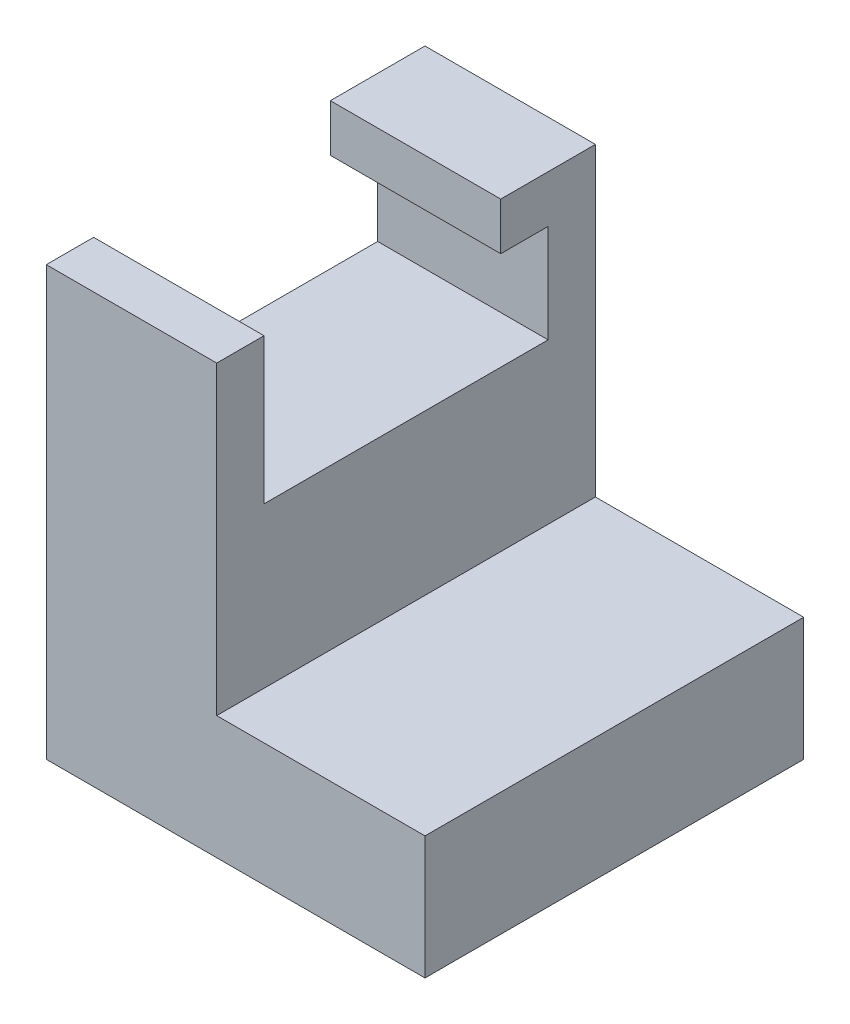
ISO-10303-21;
HEADER;
FILE_DESCRIPTION(('STEP AP214'),'2;1');
FILE_NAME('part.step','',(''),(''),'','','');
FILE_SCHEMA(('AUTOMOTIVE_DESIGN { 1 0 10303 214 1 1 1 1 }'));
ENDSEC;
DATA;
#1=APPLICATION_CONTEXT('core data for automotive mechanical design processes');
#2=APPLICATION_PROTOCOL_DEFINITION('international standard','automotive_design',2000,#1);
#3=PRODUCT_CONTEXT('',#1,'mechanical');
#4=PRODUCT('Part','Part','',(#3));
#5=PRODUCT_RELATED_PRODUCT_CATEGORY('part','',(#4));
#6=PRODUCT_DEFINITION_FORMATION('','',#4);
#7=PRODUCT_DEFINITION_CONTEXT('part definition',#1,'design');
#8=PRODUCT_DEFINITION('design','',#6,#7);
#9=PRODUCT_DEFINITION_SHAPE('','',#8);
#10=(LENGTH_UNIT() NAMED_UNIT(*) SI_UNIT(.MILLI.,.METRE.));
#11=(NAMED_UNIT(*) PLANE_ANGLE_UNIT() SI_UNIT($,.RADIAN.));
#12=(NAMED_UNIT(*) SI_UNIT($,.STERADIAN.) SOLID_ANGLE_UNIT());
#13=UNCERTAINTY_MEASURE_WITH_UNIT(LENGTH_MEASURE(1.E-05),#10,'distance_accuracy_value','');
#14=(GEOMETRIC_REPRESENTATION_CONTEXT(3) GLOBAL_UNCERTAINTY_ASSIGNED_CONTEXT((#13)) GLOBAL_UNIT_ASSIGNED_CONTEXT((#10,
#11,#12)) REPRESENTATION_CONTEXT('',''));
#15=CARTESIAN_POINT('',(0.,0.,0.));
#16=DIRECTION('',(0.,0.,1.));
#17=DIRECTION('',(1.,0.,0.));
#18=AXIS2_PLACEMENT_3D('',#15,#16,#17);
#19=CARTESIAN_POINT('',(-17.2543735035618,42.0680833709945,40.));
#20=DIRECTION('',(0.,-1.,0.));
#21=DIRECTION('',(0.,0.,-1.));
#22=AXIS2_PLACEMENT_3D('',#19,#20,#21);
#23=PLANE('',#22);
#24=DIRECTION('',(0.,0.,-1.));
#25=VECTOR('',#24,1.);
#26=CARTESIAN_POINT('',(-17.2543735035618,42.0680833709945,40.));
#27=LINE('',#26,#25);
#28=CARTESIAN_POINT('',(-17.2543735035618,42.0680833709945,40.));
#29=VERTEX_POINT('',#28);
#30=CARTESIAN_POINT('',(-17.2543735035618,42.0680833709945,35.));
#31=VERTEX_POINT('',#30);
#32=EDGE_CURVE('E143',#29,#31,#27,.T.);
#33=ORIENTED_EDGE('',*,*,#32,.T.);
#34=DIRECTION('',(1.,0.,0.));
#35=VECTOR('',#34,1.);
#36=CARTESIAN_POINT('',(-57.2543735035618,42.0680833709945,35.));
#37=LINE('',#36,#35);
#38=CARTESIAN_POINT('',(-35.2543735035618,42.0680833709945,35.));
#39=VERTEX_POINT('',#38);
#40=EDGE_CURVE('E126',#39,#31,#37,.T.);
#41=ORIENTED_EDGE('',*,*,#40,.F.);
#42=DIRECTION('',(0.,0.,-1.));
#43=VECTOR('',#42,1.);
#44=CARTESIAN_POINT('',(-35.2543735035618,42.0680833709945,40.));
#45=LINE('',#44,#43);
#46=CARTESIAN_POINT('',(-35.2543735035618,42.0680833709945,40.));
#47=VERTEX_POINT('',#46);
#48=EDGE_CURVE('E139',#47,#39,#45,.T.);
#49=ORIENTED_EDGE('',*,*,#48,.F.);
#50=DIRECTION('',(-1.,0.,0.));
#51=VECTOR('',#50,1.);
#52=CARTESIAN_POINT('',(-17.2543735035618,42.0680833709945,40.));
#53=LINE('',#52,#51);
#54=EDGE_CURVE('E89',#29,#47,#53,.T.);
#55=ORIENTED_EDGE('',*,*,#54,.F.);
#56=EDGE_LOOP('',(#33,#41,#49,#55));
#57=FACE_BOUND('',#56,.T.);
#58=ADVANCED_FACE('F33',(#57),#23,.F.);
#59=CARTESIAN_POINT('',(-17.2543735035618,42.0680833709945,40.));
#60=DIRECTION('',(-1.,0.,0.));
#61=DIRECTION('',(0.,0.,1.));
#62=AXIS2_PLACEMENT_3D('',#59,#60,#61);
#63=PLANE('',#62);
#64=DIRECTION('',(0.,0.,-1.));
#65=VECTOR('',#64,1.);
#66=CARTESIAN_POINT('',(-17.2543735035618,26.6890693876861,5.));
#67=LINE('',#66,#65);
#68=CARTESIAN_POINT('',(-17.2543735035618,26.6890693876861,35.));
#69=VERTEX_POINT('',#68);
#70=CARTESIAN_POINT('',(-17.2543735035618,26.6890693876861,5.));
#71=VERTEX_POINT('',#70);
#72=EDGE_CURVE('E182',#69,#71,#67,.T.);
#73=ORIENTED_EDGE('',*,*,#72,.F.);
#74=DIRECTION('',(0.,-1.,0.));
#75=VECTOR('',#74,1.);
#76=CARTESIAN_POINT('',(-17.2543735035618,42.0680833709945,35.));
#77=LINE('',#76,#75);
#78=EDGE_CURVE('E186',#31,#69,#77,.T.);
#79=ORIENTED_EDGE('',*,*,#78,.F.);
#80=ORIENTED_EDGE('',*,*,#32,.F.);
#81=DIRECTION('',(0.,1.,0.));
#82=VECTOR('',#81,1.);
#83=CARTESIAN_POINT('',(-17.2543735035618,42.0680833709945,40.));
#84=LINE('',#83,#82);
#85=CARTESIAN_POINT('',(-17.2543735035618,9.81808337099454,40.));
#86=VERTEX_POINT('',#85);
#87=EDGE_CURVE('E134',#86,#29,#84,.T.);
#88=ORIENTED_EDGE('',*,*,#87,.F.);
#89=DIRECTION('',(0.,0.,-1.));
#90=VECTOR('',#89,1.);
#91=CARTESIAN_POINT('',(-17.2543735035618,9.81808337099454,40.));
#92=LINE('',#91,#90);
#93=CARTESIAN_POINT('',(-17.2543735035618,9.81808337099454,0.));
#94=VERTEX_POINT('',#93);
#95=EDGE_CURVE('E118',#86,#94,#92,.T.);
#96=ORIENTED_EDGE('',*,*,#95,.T.);
#97=DIRECTION('',(0.,1.,0.));
#98=VECTOR('',#97,1.);
#99=CARTESIAN_POINT('',(-17.2543735035618,42.0680833709945,0.));
#100=LINE('',#99,#98);
#101=CARTESIAN_POINT('',(-17.2543735035618,42.0680833709945,0.));
#102=VERTEX_POINT('',#101);
#103=EDGE_CURVE('E122',#94,#102,#100,.T.);
#104=ORIENTED_EDGE('',*,*,#103,.T.);
#105=CARTESIAN_POINT('',(-17.2543735035618,42.0680833709945,10.));
#106=VERTEX_POINT('',#105);
#107=EDGE_CURVE('E142',#106,#102,#27,.T.);
#108=ORIENTED_EDGE('',*,*,#107,.F.);
#109=DIRECTION('',(0.,1.,0.));
#110=VECTOR('',#109,1.);
#111=CARTESIAN_POINT('',(-17.2543735035618,42.0680833709945,10.));
#112=LINE('',#111,#110);
#113=CARTESIAN_POINT('',(-17.2543735035618,37.0680833709945,10.));
#114=VERTEX_POINT('',#113);
#115=EDGE_CURVE('E195',#114,#106,#112,.T.);
#116=ORIENTED_EDGE('',*,*,#115,.F.);
#117=DIRECTION('',(0.,0.,1.));
#118=VECTOR('',#117,1.);
#119=CARTESIAN_POINT('',(-17.2543735035618,37.0680833709945,5.00000000000001));
#120=LINE('',#119,#118);
#121=CARTESIAN_POINT('',(-17.2543735035618,37.0680833709945,5.00000000000001));
#122=VERTEX_POINT('',#121);
#123=EDGE_CURVE('E262',#122,#114,#120,.T.);
#124=ORIENTED_EDGE('',*,*,#123,.F.);
#125=DIRECTION('',(0.,1.,0.));
#126=VECTOR('',#125,1.);
#127=CARTESIAN_POINT('',(-17.2543735035618,37.0680833709945,5.00000000000001));
#128=LINE('',#127,#126);
#129=EDGE_CURVE('E259',#71,#122,#128,.T.);
#130=ORIENTED_EDGE('',*,*,#129,.F.);
#131=EDGE_LOOP('',(#73,#79,#80,#88,#96,#104,#108,#116,#124,#130));
#132=FACE_BOUND('',#131,.T.);
#133=ADVANCED_FACE('F35',(#132),#63,.F.);
#134=CARTESIAN_POINT('',(-35.2543735035618,42.0680833709945,10.));
#135=VERTEX_POINT('',#134);
#136=CARTESIAN_POINT('',(-35.2543735035618,42.0680833709945,0.));
#137=VERTEX_POINT('',#136);
#138=EDGE_CURVE('E138',#135,#137,#45,.T.);
#139=ORIENTED_EDGE('',*,*,#138,.F.);
#140=DIRECTION('',(1.,0.,0.));
#141=VECTOR('',#140,1.);
#142=CARTESIAN_POINT('',(-57.2543735035618,42.0680833709945,10.));
#143=LINE('',#142,#141);
#144=EDGE_CURVE('E201',#135,#106,#143,.T.);
#145=ORIENTED_EDGE('',*,*,#144,.T.);
#146=ORIENTED_EDGE('',*,*,#107,.T.);
#147=DIRECTION('',(-1.,0.,0.));
#148=VECTOR('',#147,1.);
#149=CARTESIAN_POINT('',(-17.2543735035618,42.0680833709945,0.));
#150=LINE('',#149,#148);
#151=EDGE_CURVE('E125',#102,#137,#150,.T.);
#152=ORIENTED_EDGE('',*,*,#151,.T.);
#153=EDGE_LOOP('',(#139,#145,#146,#152));
#154=FACE_BOUND('',#153,.T.);
#155=ADVANCED_FACE('F229',(#154),#23,.F.);
#156=CARTESIAN_POINT('',(-35.2543735035618,42.0680833709945,40.));
#157=DIRECTION('',(1.,0.,0.));
#158=DIRECTION('',(0.,0.,-1.));
#159=AXIS2_PLACEMENT_3D('',#156,#157,#158);
#160=PLANE('',#159);
#161=DIRECTION('',(0.,-1.,0.));
#162=VECTOR('',#161,1.);
#163=CARTESIAN_POINT('',(-35.2543735035618,42.0680833709945,35.));
#164=LINE('',#163,#162);
#165=CARTESIAN_POINT('',(-35.2543735035618,26.6890693876861,35.));
#166=VERTEX_POINT('',#165);
#167=EDGE_CURVE('E148',#39,#166,#164,.T.);
#168=ORIENTED_EDGE('',*,*,#167,.T.);
#169=DIRECTION('',(0.,0.,-1.));
#170=VECTOR('',#169,1.);
#171=CARTESIAN_POINT('',(-35.2543735035618,26.6890693876861,40.));
#172=LINE('',#171,#170);
#173=CARTESIAN_POINT('',(-35.2543735035618,26.6890693876861,5.));
#174=VERTEX_POINT('',#173);
#175=EDGE_CURVE('E11',#166,#174,#172,.T.);
#176=ORIENTED_EDGE('',*,*,#175,.T.);
#177=DIRECTION('',(0.,1.,0.));
#178=VECTOR('',#177,1.);
#179=CARTESIAN_POINT('',(-35.2543735035618,42.0680833709945,5.));
#180=LINE('',#179,#178);
#181=CARTESIAN_POINT('',(-35.2543735035618,37.0680833709945,5.00000000000001));
#182=VERTEX_POINT('',#181);
#183=EDGE_CURVE('E42',#174,#182,#180,.T.);
#184=ORIENTED_EDGE('',*,*,#183,.T.);
#185=DIRECTION('',(0.,0.,1.));
#186=VECTOR('',#185,1.);
#187=CARTESIAN_POINT('',(-35.2543735035618,37.0680833709945,40.));
#188=LINE('',#187,#186);
#189=CARTESIAN_POINT('',(-35.2543735035618,37.0680833709945,10.));
#190=VERTEX_POINT('',#189);
#191=EDGE_CURVE('E158',#182,#190,#188,.T.);
#192=ORIENTED_EDGE('',*,*,#191,.T.);
#193=DIRECTION('',(0.,1.,0.));
#194=VECTOR('',#193,1.);
#195=CARTESIAN_POINT('',(-35.2543735035618,42.0680833709945,10.));
#196=LINE('',#195,#194);
#197=EDGE_CURVE('E145',#190,#135,#196,.T.);
#198=ORIENTED_EDGE('',*,*,#197,.T.);
#199=ORIENTED_EDGE('',*,*,#138,.T.);
#200=DIRECTION('',(0.,-1.,0.));
#201=VECTOR('',#200,1.);
#202=CARTESIAN_POINT('',(-35.2543735035618,42.0680833709945,0.));
#203=LINE('',#202,#201);
#204=CARTESIAN_POINT('',(-35.2543735035618,-3.18191662900546,0.));
#205=VERTEX_POINT('',#204);
#206=EDGE_CURVE('E129',#137,#205,#203,.T.);
#207=ORIENTED_EDGE('',*,*,#206,.T.);
#208=DIRECTION('',(0.,0.,-1.));
#209=VECTOR('',#208,1.);
#210=CARTESIAN_POINT('',(-35.2543735035618,-3.18191662900546,40.));
#211=LINE('',#210,#209);
#212=CARTESIAN_POINT('',(-35.2543735035618,-3.18191662900546,40.));
#213=VERTEX_POINT('',#212);
#214=EDGE_CURVE('E113',#213,#205,#211,.T.);
#215=ORIENTED_EDGE('',*,*,#214,.F.);
#216=DIRECTION('',(0.,-1.,0.));
#217=VECTOR('',#216,1.);
#218=CARTESIAN_POINT('',(-35.2543735035618,42.0680833709945,40.));
#219=LINE('',#218,#217);
#220=EDGE_CURVE('E104',#47,#213,#219,.T.);
#221=ORIENTED_EDGE('',*,*,#220,.F.);
#222=ORIENTED_EDGE('',*,*,#48,.T.);
#223=EDGE_LOOP('',(#168,#176,#184,#192,#198,#199,#207,#215,#221,#222));
#224=FACE_BOUND('',#223,.T.);
#225=ADVANCED_FACE('F155',(#224),#160,.F.);
#226=CARTESIAN_POINT('',(-35.2543735035618,-3.18191662900546,40.));
#227=DIRECTION('',(0.,1.,0.));
#228=DIRECTION('',(0.,0.,1.));
#229=AXIS2_PLACEMENT_3D('',#226,#227,#228);
#230=PLANE('',#229);
#231=DIRECTION('',(1.,0.,0.));
#232=VECTOR('',#231,1.);
#233=CARTESIAN_POINT('',(-35.2543735035618,-3.18191662900546,0.));
#234=LINE('',#233,#232);
#235=CARTESIAN_POINT('',(4.74562649643821,-3.18191662900546,0.));
#236=VERTEX_POINT('',#235);
#237=EDGE_CURVE('E112',#205,#236,#234,.T.);
#238=ORIENTED_EDGE('',*,*,#237,.T.);
#239=DIRECTION('',(0.,0.,-1.));
#240=VECTOR('',#239,1.);
#241=CARTESIAN_POINT('',(4.74562649643821,-3.18191662900546,40.));
#242=LINE('',#241,#240);
#243=CARTESIAN_POINT('',(4.74562649643821,-3.18191662900546,40.));
#244=VERTEX_POINT('',#243);
#245=EDGE_CURVE('E109',#244,#236,#242,.T.);
#246=ORIENTED_EDGE('',*,*,#245,.F.);
#247=DIRECTION('',(1.,0.,0.));
#248=VECTOR('',#247,1.);
#249=CARTESIAN_POINT('',(-35.2543735035618,-3.18191662900546,40.));
#250=LINE('',#249,#248);
#251=EDGE_CURVE('E98',#213,#244,#250,.T.);
#252=ORIENTED_EDGE('',*,*,#251,.F.);
#253=ORIENTED_EDGE('',*,*,#214,.T.);
#254=EDGE_LOOP('',(#238,#246,#252,#253));
#255=FACE_BOUND('',#254,.T.);
#256=ADVANCED_FACE('F110',(#255),#230,.F.);
#257=CARTESIAN_POINT('',(4.74562649643821,-3.18191662900546,40.));
#258=DIRECTION('',(-1.,0.,0.));
#259=DIRECTION('',(0.,-1.,0.));
#260=AXIS2_PLACEMENT_3D('',#257,#258,#259);
#261=PLANE('',#260);
#262=DIRECTION('',(0.,1.,0.));
#263=VECTOR('',#262,1.);
#264=CARTESIAN_POINT('',(4.74562649643821,-3.18191662900546,0.));
#265=LINE('',#264,#263);
#266=CARTESIAN_POINT('',(4.74562649643821,9.81808337099454,0.));
#267=VERTEX_POINT('',#266);
#268=EDGE_CURVE('E74',#236,#267,#265,.T.);
#269=ORIENTED_EDGE('',*,*,#268,.T.);
#270=DIRECTION('',(0.,0.,-1.));
#271=VECTOR('',#270,1.);
#272=CARTESIAN_POINT('',(4.74562649643821,9.81808337099454,40.));
#273=LINE('',#272,#271);
#274=CARTESIAN_POINT('',(4.74562649643821,9.81808337099454,40.));
#275=VERTEX_POINT('',#274);
#276=EDGE_CURVE('E114',#275,#267,#273,.T.);
#277=ORIENTED_EDGE('',*,*,#276,.F.);
#278=DIRECTION('',(0.,1.,0.));
#279=VECTOR('',#278,1.);
#280=CARTESIAN_POINT('',(4.74562649643821,-3.18191662900546,40.));
#281=LINE('',#280,#279);
#282=EDGE_CURVE('E102',#244,#275,#281,.T.);
#283=ORIENTED_EDGE('',*,*,#282,.F.);
#284=ORIENTED_EDGE('',*,*,#245,.T.);
#285=EDGE_LOOP('',(#269,#277,#283,#284));
#286=FACE_BOUND('',#285,.T.);
#287=ADVANCED_FACE('F116',(#286),#261,.F.);
#288=CARTESIAN_POINT('',(4.74562649643821,9.81808337099454,40.));
#289=DIRECTION('',(0.,-1.,0.));
#290=DIRECTION('',(1.,0.,0.));
#291=AXIS2_PLACEMENT_3D('',#288,#289,#290);
#292=PLANE('',#291);
#293=DIRECTION('',(-1.,0.,0.));
#294=VECTOR('',#293,1.);
#295=CARTESIAN_POINT('',(4.74562649643821,9.81808337099454,0.));
#296=LINE('',#295,#294);
#297=EDGE_CURVE('E80',#267,#94,#296,.T.);
#298=ORIENTED_EDGE('',*,*,#297,.T.);
#299=ORIENTED_EDGE('',*,*,#95,.F.);
#300=DIRECTION('',(-1.,0.,0.));
#301=VECTOR('',#300,1.);
#302=CARTESIAN_POINT('',(4.74562649643821,9.81808337099454,40.));
#303=LINE('',#302,#301);
#304=EDGE_CURVE('E50',#275,#86,#303,.T.);
#305=ORIENTED_EDGE('',*,*,#304,.F.);
#306=ORIENTED_EDGE('',*,*,#276,.T.);
#307=EDGE_LOOP('',(#298,#299,#305,#306));
#308=FACE_BOUND('',#307,.T.);
#309=ADVANCED_FACE('F218',(#308),#292,.F.);
#310=CARTESIAN_POINT('',(0.,0.,40.));
#311=DIRECTION('',(0.,0.,-1.));
#312=DIRECTION('',(-1.,0.,0.));
#313=AXIS2_PLACEMENT_3D('',#310,#311,#312);
#314=PLANE('',#313);
#315=ORIENTED_EDGE('',*,*,#87,.T.);
#316=ORIENTED_EDGE('',*,*,#54,.T.);
#317=ORIENTED_EDGE('',*,*,#220,.T.);
#318=ORIENTED_EDGE('',*,*,#251,.T.);
#319=ORIENTED_EDGE('',*,*,#282,.T.);
#320=ORIENTED_EDGE('',*,*,#304,.T.);
#321=EDGE_LOOP('',(#315,#316,#317,#318,#319,#320));
#322=FACE_BOUND('',#321,.T.);
#323=ADVANCED_FACE('F100',(#322),#314,.F.);
#324=CARTESIAN_POINT('',(0.,0.,0.));
#325=DIRECTION('',(0.,0.,-1.));
#326=DIRECTION('',(-1.,0.,0.));
#327=AXIS2_PLACEMENT_3D('',#324,#325,#326);
#328=PLANE('',#327);
#329=ORIENTED_EDGE('',*,*,#103,.F.);
#330=ORIENTED_EDGE('',*,*,#297,.F.);
#331=ORIENTED_EDGE('',*,*,#268,.F.);
#332=ORIENTED_EDGE('',*,*,#237,.F.);
#333=ORIENTED_EDGE('',*,*,#206,.F.);
#334=ORIENTED_EDGE('',*,*,#151,.F.);
#335=EDGE_LOOP('',(#329,#330,#331,#332,#333,#334));
#336=FACE_BOUND('',#335,.T.);
#337=ADVANCED_FACE('F213',(#336),#328,.T.);
#338=CARTESIAN_POINT('',(-57.2543735035618,42.0680833709945,35.));
#339=DIRECTION('',(0.,0.,1.));
#340=DIRECTION('',(1.,0.,0.));
#341=AXIS2_PLACEMENT_3D('',#338,#339,#340);
#342=PLANE('',#341);
#343=ORIENTED_EDGE('',*,*,#40,.T.);
#344=ORIENTED_EDGE('',*,*,#78,.T.);
#345=DIRECTION('',(1.,0.,0.));
#346=VECTOR('',#345,1.);
#347=CARTESIAN_POINT('',(-57.2543735035618,26.6890693876861,35.));
#348=LINE('',#347,#346);
#349=EDGE_CURVE('E184',#166,#69,#348,.T.);
#350=ORIENTED_EDGE('',*,*,#349,.F.);
#351=ORIENTED_EDGE('',*,*,#167,.F.);
#352=EDGE_LOOP('',(#343,#344,#350,#351));
#353=FACE_BOUND('',#352,.T.);
#354=ADVANCED_FACE('F256',(#353),#342,.F.);
#355=CARTESIAN_POINT('',(-57.2543735035618,42.0680833709945,10.));
#356=DIRECTION('',(0.,0.,-1.));
#357=DIRECTION('',(-1.,0.,0.));
#358=AXIS2_PLACEMENT_3D('',#355,#356,#357);
#359=PLANE('',#358);
#360=DIRECTION('',(1.,0.,0.));
#361=VECTOR('',#360,1.);
#362=CARTESIAN_POINT('',(-57.2543735035618,37.0680833709945,10.));
#363=LINE('',#362,#361);
#364=EDGE_CURVE('E198',#190,#114,#363,.T.);
#365=ORIENTED_EDGE('',*,*,#364,.T.);
#366=ORIENTED_EDGE('',*,*,#115,.T.);
#367=ORIENTED_EDGE('',*,*,#144,.F.);
#368=ORIENTED_EDGE('',*,*,#197,.F.);
#369=EDGE_LOOP('',(#365,#366,#367,#368));
#370=FACE_BOUND('',#369,.T.);
#371=ADVANCED_FACE('F244',(#370),#359,.F.);
#372=CARTESIAN_POINT('',(-57.2543735035618,37.0680833709945,5.00000000000001));
#373=DIRECTION('',(0.,0.,-1.));
#374=DIRECTION('',(0.,1.,0.));
#375=AXIS2_PLACEMENT_3D('',#372,#373,#374);
#376=PLANE('',#375);
#377=DIRECTION('',(1.,0.,0.));
#378=VECTOR('',#377,1.);
#379=CARTESIAN_POINT('',(-57.2543735035618,26.6890693876861,5.));
#380=LINE('',#379,#378);
#381=EDGE_CURVE('E171',#174,#71,#380,.T.);
#382=ORIENTED_EDGE('',*,*,#381,.T.);
#383=ORIENTED_EDGE('',*,*,#129,.T.);
#384=DIRECTION('',(1.,0.,0.));
#385=VECTOR('',#384,1.);
#386=CARTESIAN_POINT('',(-57.2543735035618,37.0680833709945,5.00000000000001));
#387=LINE('',#386,#385);
#388=EDGE_CURVE('E174',#182,#122,#387,.T.);
#389=ORIENTED_EDGE('',*,*,#388,.F.);
#390=ORIENTED_EDGE('',*,*,#183,.F.);
#391=EDGE_LOOP('',(#382,#383,#389,#390));
#392=FACE_BOUND('',#391,.T.);
#393=ADVANCED_FACE('F168',(#392),#376,.F.);
#394=CARTESIAN_POINT('',(-57.2543735035618,26.6890693876861,5.));
#395=DIRECTION('',(0.,-1.,0.));
#396=DIRECTION('',(0.,0.,-1.));
#397=AXIS2_PLACEMENT_3D('',#394,#395,#396);
#398=PLANE('',#397);
#399=ORIENTED_EDGE('',*,*,#349,.T.);
#400=ORIENTED_EDGE('',*,*,#72,.T.);
#401=ORIENTED_EDGE('',*,*,#381,.F.);
#402=ORIENTED_EDGE('',*,*,#175,.F.);
#403=EDGE_LOOP('',(#399,#400,#401,#402));
#404=FACE_BOUND('',#403,.T.);
#405=ADVANCED_FACE('F179',(#404),#398,.F.);
#406=CARTESIAN_POINT('',(-57.2543735035618,37.0680833709945,5.00000000000001));
#407=DIRECTION('',(0.,1.,0.));
#408=DIRECTION('',(0.,0.,1.));
#409=AXIS2_PLACEMENT_3D('',#406,#407,#408);
#410=PLANE('',#409);
#411=ORIENTED_EDGE('',*,*,#388,.T.);
#412=ORIENTED_EDGE('',*,*,#123,.T.);
#413=ORIENTED_EDGE('',*,*,#364,.F.);
#414=ORIENTED_EDGE('',*,*,#191,.F.);
#415=EDGE_LOOP('',(#411,#412,#413,#414));
#416=FACE_BOUND('',#415,.T.);
#417=ADVANCED_FACE('F267',(#416),#410,.F.);
#418=CLOSED_SHELL('',(#58,#133,#155,#225,#256,#287,#309,#323,#337,#354,#371,#393,#405,#417));
#419=MANIFOLD_SOLID_BREP('B2',#418);
#420=ADVANCED_BREP_SHAPE_REPRESENTATION('',(#18,#419),#14);
#421=SHAPE_DEFINITION_REPRESENTATION(#9,#420);
ENDSEC;
END-ISO-10303-21;
